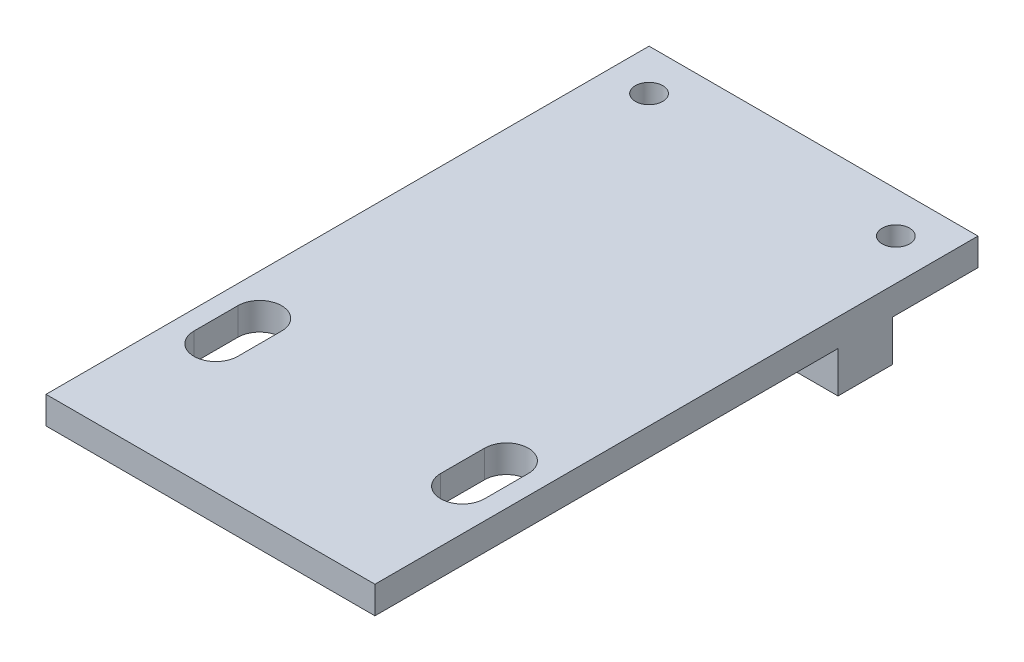
ISO-10303-21;
HEADER;
FILE_DESCRIPTION(('STEP AP214'),'2;1');
FILE_NAME('part.step','',(''),(''),'','','');
FILE_SCHEMA(('AUTOMOTIVE_DESIGN { 1 0 10303 214 1 1 1 1 }'));
ENDSEC;
DATA;
#1=APPLICATION_CONTEXT('core data for automotive mechanical design processes');
#2=APPLICATION_PROTOCOL_DEFINITION('international standard','automotive_design',2000,#1);
#3=PRODUCT_CONTEXT('',#1,'mechanical');
#4=PRODUCT('Part','Part','',(#3));
#5=PRODUCT_RELATED_PRODUCT_CATEGORY('part','',(#4));
#6=PRODUCT_DEFINITION_FORMATION('','',#4);
#7=PRODUCT_DEFINITION_CONTEXT('part definition',#1,'design');
#8=PRODUCT_DEFINITION('design','',#6,#7);
#9=PRODUCT_DEFINITION_SHAPE('','',#8);
#10=(LENGTH_UNIT() NAMED_UNIT(*) SI_UNIT(.MILLI.,.METRE.));
#11=(NAMED_UNIT(*) PLANE_ANGLE_UNIT() SI_UNIT($,.RADIAN.));
#12=(NAMED_UNIT(*) SI_UNIT($,.STERADIAN.) SOLID_ANGLE_UNIT());
#13=UNCERTAINTY_MEASURE_WITH_UNIT(LENGTH_MEASURE(1.E-05),#10,'distance_accuracy_value','');
#14=(GEOMETRIC_REPRESENTATION_CONTEXT(3) GLOBAL_UNCERTAINTY_ASSIGNED_CONTEXT((#13)) GLOBAL_UNIT_ASSIGNED_CONTEXT((#10,
#11,#12)) REPRESENTATION_CONTEXT('',''));
#15=CARTESIAN_POINT('',(0.,0.,0.));
#16=DIRECTION('',(0.,0.,1.));
#17=DIRECTION('',(1.,0.,0.));
#18=AXIS2_PLACEMENT_3D('',#15,#16,#17);
#19=CARTESIAN_POINT('',(0.,0.,0.));
#20=DIRECTION('',(0.,-1.,0.));
#21=DIRECTION('',(0.,0.,-1.));
#22=AXIS2_PLACEMENT_3D('',#19,#20,#21);
#23=PLANE('',#22);
#24=DIRECTION('',(0.,0.,1.));
#25=VECTOR('',#24,1.);
#26=CARTESIAN_POINT('',(1.39715437145116,0.,0.));
#27=LINE('',#26,#25);
#28=CARTESIAN_POINT('',(1.39715437145116,0.,-16.5950768512365));
#29=VERTEX_POINT('',#28);
#30=CARTESIAN_POINT('',(1.39715437145116,0.,-13.3950768512365));
#31=VERTEX_POINT('',#30);
#32=EDGE_CURVE('E258',#29,#31,#27,.T.);
#33=ORIENTED_EDGE('',*,*,#32,.T.);
#34=CARTESIAN_POINT('',(2.99715437145116,0.,-13.3950768512365));
#35=DIRECTION('',(0.,1.,0.));
#36=DIRECTION('',(0.,0.,1.));
#37=AXIS2_PLACEMENT_3D('',#34,#35,#36);
#38=CIRCLE('',#37,1.6);
#39=CARTESIAN_POINT('',(4.59715437145116,0.,-13.3950768512365));
#40=VERTEX_POINT('',#39);
#41=EDGE_CURVE('E261',#31,#40,#38,.T.);
#42=ORIENTED_EDGE('',*,*,#41,.T.);
#43=DIRECTION('',(0.,0.,1.));
#44=VECTOR('',#43,1.);
#45=CARTESIAN_POINT('',(4.59715437145116,0.,0.));
#46=LINE('',#45,#44);
#47=CARTESIAN_POINT('',(4.59715437145116,0.,-16.5950768512365));
#48=VERTEX_POINT('',#47);
#49=EDGE_CURVE('E265',#48,#40,#46,.T.);
#50=ORIENTED_EDGE('',*,*,#49,.F.);
#51=CARTESIAN_POINT('',(2.99715437145116,0.,-16.5950768512365));
#52=DIRECTION('',(0.,1.,0.));
#53=DIRECTION('',(0.,0.,1.));
#54=AXIS2_PLACEMENT_3D('',#51,#52,#53);
#55=CIRCLE('',#54,1.6);
#56=EDGE_CURVE('E268',#48,#29,#55,.T.);
#57=ORIENTED_EDGE('',*,*,#56,.T.);
#58=EDGE_LOOP('',(#33,#42,#50,#57));
#59=FACE_BOUND('',#58,.T.);
#60=DIRECTION('',(0.,0.,1.));
#61=VECTOR('',#60,1.);
#62=CARTESIAN_POINT('',(19.4000469244504,0.,0.));
#63=LINE('',#62,#61);
#64=CARTESIAN_POINT('',(19.4000469244504,0.,-16.5950768512365));
#65=VERTEX_POINT('',#64);
#66=CARTESIAN_POINT('',(19.4000469244504,0.,-13.3950768512365));
#67=VERTEX_POINT('',#66);
#68=EDGE_CURVE('E226',#65,#67,#63,.T.);
#69=ORIENTED_EDGE('',*,*,#68,.T.);
#70=CARTESIAN_POINT('',(21.0000469244504,0.,-13.3950768512365));
#71=DIRECTION('',(0.,1.,0.));
#72=DIRECTION('',(0.,0.,1.));
#73=AXIS2_PLACEMENT_3D('',#70,#71,#72);
#74=CIRCLE('',#73,1.6);
#75=CARTESIAN_POINT('',(22.6000469244504,0.,-13.3950768512365));
#76=VERTEX_POINT('',#75);
#77=EDGE_CURVE('E229',#67,#76,#74,.T.);
#78=ORIENTED_EDGE('',*,*,#77,.T.);
#79=DIRECTION('',(0.,0.,1.));
#80=VECTOR('',#79,1.);
#81=CARTESIAN_POINT('',(22.6000469244504,0.,0.));
#82=LINE('',#81,#80);
#83=CARTESIAN_POINT('',(22.6000469244504,0.,-16.5950768512365));
#84=VERTEX_POINT('',#83);
#85=EDGE_CURVE('E233',#84,#76,#82,.T.);
#86=ORIENTED_EDGE('',*,*,#85,.F.);
#87=CARTESIAN_POINT('',(21.0000469244504,0.,-16.5950768512365));
#88=DIRECTION('',(0.,1.,0.));
#89=DIRECTION('',(0.,0.,1.));
#90=AXIS2_PLACEMENT_3D('',#87,#88,#89);
#91=CIRCLE('',#90,1.6);
#92=EDGE_CURVE('E236',#84,#65,#91,.T.);
#93=ORIENTED_EDGE('',*,*,#92,.T.);
#94=EDGE_LOOP('',(#69,#78,#86,#93));
#95=FACE_BOUND('',#94,.T.);
#96=DIRECTION('',(0.,0.,-1.));
#97=VECTOR('',#96,1.);
#98=CARTESIAN_POINT('',(24.,0.,0.));
#99=LINE('',#98,#97);
#100=CARTESIAN_POINT('',(24.,0.,-4.));
#101=VERTEX_POINT('',#100);
#102=CARTESIAN_POINT('',(24.,0.,-37.7832741595441));
#103=VERTEX_POINT('',#102);
#104=EDGE_CURVE('E194',#101,#103,#99,.T.);
#105=ORIENTED_EDGE('',*,*,#104,.F.);
#106=DIRECTION('',(1.,0.,0.));
#107=VECTOR('',#106,1.);
#108=CARTESIAN_POINT('',(24.,0.,-4.));
#109=LINE('',#108,#107);
#110=CARTESIAN_POINT('',(0.,0.,-4.));
#111=VERTEX_POINT('',#110);
#112=EDGE_CURVE('E184',#111,#101,#109,.T.);
#113=ORIENTED_EDGE('',*,*,#112,.F.);
#114=DIRECTION('',(0.,0.,1.));
#115=VECTOR('',#114,1.);
#116=CARTESIAN_POINT('',(0.,0.,0.));
#117=LINE('',#116,#115);
#118=CARTESIAN_POINT('',(0.,0.,-37.7832741595441));
#119=VERTEX_POINT('',#118);
#120=EDGE_CURVE('E59',#119,#111,#117,.T.);
#121=ORIENTED_EDGE('',*,*,#120,.F.);
#122=DIRECTION('',(-1.,0.,0.));
#123=VECTOR('',#122,1.);
#124=CARTESIAN_POINT('',(9.99674954252594,0.,-37.7832741595441));
#125=LINE('',#124,#123);
#126=CARTESIAN_POINT('',(9.99674954252594,0.,-37.7832741595441));
#127=VERTEX_POINT('',#126);
#128=EDGE_CURVE('E380',#127,#119,#125,.T.);
#129=ORIENTED_EDGE('',*,*,#128,.F.);
#130=DIRECTION('',(0.,0.,-1.));
#131=VECTOR('',#130,1.);
#132=CARTESIAN_POINT('',(9.99674954252594,0.,-19.1071709937525));
#133=LINE('',#132,#131);
#134=CARTESIAN_POINT('',(9.99674954252594,0.,-19.1071709937525));
#135=VERTEX_POINT('',#134);
#136=EDGE_CURVE('E209',#135,#127,#133,.T.);
#137=ORIENTED_EDGE('',*,*,#136,.F.);
#138=DIRECTION('',(-1.,0.,0.));
#139=VECTOR('',#138,1.);
#140=CARTESIAN_POINT('',(9.99674954252594,0.,-19.1071709937525));
#141=LINE('',#140,#139);
#142=CARTESIAN_POINT('',(13.9993789873554,0.,-19.1071709937525));
#143=VERTEX_POINT('',#142);
#144=EDGE_CURVE('E213',#143,#135,#141,.T.);
#145=ORIENTED_EDGE('',*,*,#144,.F.);
#146=DIRECTION('',(0.,0.,1.));
#147=VECTOR('',#146,1.);
#148=CARTESIAN_POINT('',(13.9993789873554,0.,-19.1071709937525));
#149=LINE('',#148,#147);
#150=CARTESIAN_POINT('',(13.9993789873554,0.,-37.7832741595441));
#151=VERTEX_POINT('',#150);
#152=EDGE_CURVE('E37',#151,#143,#149,.T.);
#153=ORIENTED_EDGE('',*,*,#152,.F.);
#154=DIRECTION('',(-1.,0.,0.));
#155=VECTOR('',#154,1.);
#156=CARTESIAN_POINT('',(13.9993789873554,0.,-37.7832741595441));
#157=LINE('',#156,#155);
#158=EDGE_CURVE('E336',#103,#151,#157,.T.);
#159=ORIENTED_EDGE('',*,*,#158,.F.);
#160=EDGE_LOOP('',(#105,#113,#121,#129,#137,#145,#153,#159));
#161=FACE_BOUND('',#160,.T.);
#162=ADVANCED_FACE('F33',(#59,#95,#161),#23,.T.);
#163=CARTESIAN_POINT('',(0.,2.,0.));
#164=DIRECTION('',(1.,0.,0.));
#165=DIRECTION('',(0.,0.,-1.));
#166=AXIS2_PLACEMENT_3D('',#163,#164,#165);
#167=PLANE('',#166);
#168=DIRECTION('',(0.,-1.,0.));
#169=VECTOR('',#168,1.);
#170=CARTESIAN_POINT('',(0.,0.,-4.));
#171=LINE('',#170,#169);
#172=CARTESIAN_POINT('',(0.,2.,-4.));
#173=VERTEX_POINT('',#172);
#174=EDGE_CURVE('E174',#173,#111,#171,.T.);
#175=ORIENTED_EDGE('',*,*,#174,.F.);
#176=DIRECTION('',(0.,0.,1.));
#177=VECTOR('',#176,1.);
#178=CARTESIAN_POINT('',(0.,2.,0.));
#179=LINE('',#178,#177);
#180=CARTESIAN_POINT('',(0.,2.,-48.));
#181=VERTEX_POINT('',#180);
#182=EDGE_CURVE('E182',#181,#173,#179,.T.);
#183=ORIENTED_EDGE('',*,*,#182,.F.);
#184=DIRECTION('',(0.,-1.,0.));
#185=VECTOR('',#184,1.);
#186=CARTESIAN_POINT('',(0.,2.,-48.));
#187=LINE('',#186,#185);
#188=CARTESIAN_POINT('',(0.,0.,-48.));
#189=VERTEX_POINT('',#188);
#190=EDGE_CURVE('E43',#181,#189,#187,.T.);
#191=ORIENTED_EDGE('',*,*,#190,.T.);
#192=CARTESIAN_POINT('',(0.,0.,-41.7785444372392));
#193=VERTEX_POINT('',#192);
#194=EDGE_CURVE('E201',#189,#193,#117,.T.);
#195=ORIENTED_EDGE('',*,*,#194,.T.);
#196=DIRECTION('',(0.,1.,0.));
#197=VECTOR('',#196,1.);
#198=CARTESIAN_POINT('',(0.,-3.,-41.7785444372392));
#199=LINE('',#198,#197);
#200=CARTESIAN_POINT('',(0.,-3.,-41.7785444372392));
#201=VERTEX_POINT('',#200);
#202=EDGE_CURVE('E382',#201,#193,#199,.T.);
#203=ORIENTED_EDGE('',*,*,#202,.F.);
#204=DIRECTION('',(0.,0.,-1.));
#205=VECTOR('',#204,1.);
#206=CARTESIAN_POINT('',(0.,-3.,-41.7785444372392));
#207=LINE('',#206,#205);
#208=CARTESIAN_POINT('',(0.,-3.,-37.7832741595441));
#209=VERTEX_POINT('',#208);
#210=EDGE_CURVE('E379',#209,#201,#207,.T.);
#211=ORIENTED_EDGE('',*,*,#210,.F.);
#212=DIRECTION('',(0.,1.,0.));
#213=VECTOR('',#212,1.);
#214=CARTESIAN_POINT('',(0.,-3.,-37.7832741595441));
#215=LINE('',#214,#213);
#216=EDGE_CURVE('E377',#209,#119,#215,.T.);
#217=ORIENTED_EDGE('',*,*,#216,.T.);
#218=ORIENTED_EDGE('',*,*,#120,.T.);
#219=EDGE_LOOP('',(#175,#183,#191,#195,#203,#211,#217,#218));
#220=FACE_BOUND('',#219,.T.);
#221=ADVANCED_FACE('F35',(#220),#167,.F.);
#222=CARTESIAN_POINT('',(24.,2.,0.));
#223=DIRECTION('',(-1.,0.,0.));
#224=DIRECTION('',(0.,0.,1.));
#225=AXIS2_PLACEMENT_3D('',#222,#223,#224);
#226=PLANE('',#225);
#227=DIRECTION('',(0.,1.,0.));
#228=VECTOR('',#227,1.);
#229=CARTESIAN_POINT('',(24.,0.,-4.));
#230=LINE('',#229,#228);
#231=CARTESIAN_POINT('',(24.,2.,-4.));
#232=VERTEX_POINT('',#231);
#233=EDGE_CURVE('E51',#101,#232,#230,.T.);
#234=ORIENTED_EDGE('',*,*,#233,.F.);
#235=ORIENTED_EDGE('',*,*,#104,.T.);
#236=DIRECTION('',(0.,1.,0.));
#237=VECTOR('',#236,1.);
#238=CARTESIAN_POINT('',(24.,-3.,-37.7832741595441));
#239=LINE('',#238,#237);
#240=CARTESIAN_POINT('',(24.,-3.,-37.7832741595441));
#241=VERTEX_POINT('',#240);
#242=EDGE_CURVE('E341',#241,#103,#239,.T.);
#243=ORIENTED_EDGE('',*,*,#242,.F.);
#244=DIRECTION('',(0.,0.,1.));
#245=VECTOR('',#244,1.);
#246=CARTESIAN_POINT('',(24.,-3.,-41.7785444372392));
#247=LINE('',#246,#245);
#248=CARTESIAN_POINT('',(24.,-3.,-41.7785444372392));
#249=VERTEX_POINT('',#248);
#250=EDGE_CURVE('E391',#249,#241,#247,.T.);
#251=ORIENTED_EDGE('',*,*,#250,.F.);
#252=DIRECTION('',(0.,1.,0.));
#253=VECTOR('',#252,1.);
#254=CARTESIAN_POINT('',(24.,-3.,-41.7785444372392));
#255=LINE('',#254,#253);
#256=CARTESIAN_POINT('',(24.,0.,-41.7785444372392));
#257=VERTEX_POINT('',#256);
#258=EDGE_CURVE('E348',#249,#257,#255,.T.);
#259=ORIENTED_EDGE('',*,*,#258,.T.);
#260=CARTESIAN_POINT('',(24.,0.,-48.));
#261=VERTEX_POINT('',#260);
#262=EDGE_CURVE('E204',#257,#261,#99,.T.);
#263=ORIENTED_EDGE('',*,*,#262,.T.);
#264=DIRECTION('',(0.,-1.,0.));
#265=VECTOR('',#264,1.);
#266=CARTESIAN_POINT('',(24.,2.,-48.));
#267=LINE('',#266,#265);
#268=CARTESIAN_POINT('',(24.,2.,-48.));
#269=VERTEX_POINT('',#268);
#270=EDGE_CURVE('E11',#269,#261,#267,.T.);
#271=ORIENTED_EDGE('',*,*,#270,.F.);
#272=DIRECTION('',(0.,0.,-1.));
#273=VECTOR('',#272,1.);
#274=CARTESIAN_POINT('',(24.,2.,0.));
#275=LINE('',#274,#273);
#276=EDGE_CURVE('E190',#232,#269,#275,.T.);
#277=ORIENTED_EDGE('',*,*,#276,.F.);
#278=EDGE_LOOP('',(#234,#235,#243,#251,#259,#263,#271,#277));
#279=FACE_BOUND('',#278,.T.);
#280=ADVANCED_FACE('F306',(#279),#226,.F.);
#281=CARTESIAN_POINT('',(0.,2.,0.));
#282=DIRECTION('',(0.,-1.,0.));
#283=DIRECTION('',(0.,0.,-1.));
#284=AXIS2_PLACEMENT_3D('',#281,#282,#283);
#285=PLANE('',#284);
#286=CARTESIAN_POINT('',(2.99574275563261,2.,-45.0048101927837));
#287=DIRECTION('',(0.,1.,0.));
#288=DIRECTION('',(0.,0.,1.));
#289=AXIS2_PLACEMENT_3D('',#286,#287,#288);
#290=CIRCLE('',#289,1.);
#291=CARTESIAN_POINT('',(2.99574275563261,2.,-44.0048101927837));
#292=VERTEX_POINT('',#291);
#293=EDGE_CURVE('E197',#292,#292,#290,.T.);
#294=ORIENTED_EDGE('',*,*,#293,.F.);
#295=EDGE_LOOP('',(#294));
#296=FACE_BOUND('',#295,.T.);
#297=CARTESIAN_POINT('',(21.0005283156328,2.,-45.0048101927837));
#298=DIRECTION('',(0.,1.,0.));
#299=DIRECTION('',(0.,0.,1.));
#300=AXIS2_PLACEMENT_3D('',#297,#298,#299);
#301=CIRCLE('',#300,1.);
#302=CARTESIAN_POINT('',(21.0005283156328,2.,-44.0048101927837));
#303=VERTEX_POINT('',#302);
#304=EDGE_CURVE('E283',#303,#303,#301,.T.);
#305=ORIENTED_EDGE('',*,*,#304,.F.);
#306=EDGE_LOOP('',(#305));
#307=FACE_BOUND('',#306,.T.);
#308=CARTESIAN_POINT('',(2.99715437145116,2.,-13.3950768512365));
#309=DIRECTION('',(0.,1.,0.));
#310=DIRECTION('',(0.,0.,1.));
#311=AXIS2_PLACEMENT_3D('',#308,#309,#310);
#312=CIRCLE('',#311,1.6);
#313=CARTESIAN_POINT('',(1.39715437145116,2.,-13.3950768512365));
#314=VERTEX_POINT('',#313);
#315=CARTESIAN_POINT('',(4.59715437145116,2.,-13.3950768512365));
#316=VERTEX_POINT('',#315);
#317=EDGE_CURVE('E273',#314,#316,#312,.T.);
#318=ORIENTED_EDGE('',*,*,#317,.F.);
#319=DIRECTION('',(0.,0.,1.));
#320=VECTOR('',#319,1.);
#321=CARTESIAN_POINT('',(1.39715437145116,2.,0.));
#322=LINE('',#321,#320);
#323=CARTESIAN_POINT('',(1.39715437145116,2.,-16.5950768512365));
#324=VERTEX_POINT('',#323);
#325=EDGE_CURVE('E251',#324,#314,#322,.T.);
#326=ORIENTED_EDGE('',*,*,#325,.F.);
#327=CARTESIAN_POINT('',(2.99715437145116,2.,-16.5950768512365));
#328=DIRECTION('',(0.,1.,0.));
#329=DIRECTION('',(0.,0.,1.));
#330=AXIS2_PLACEMENT_3D('',#327,#328,#329);
#331=CIRCLE('',#330,1.6);
#332=CARTESIAN_POINT('',(4.59715437145116,2.,-16.5950768512365));
#333=VERTEX_POINT('',#332);
#334=EDGE_CURVE('E262',#333,#324,#331,.T.);
#335=ORIENTED_EDGE('',*,*,#334,.F.);
#336=DIRECTION('',(0.,0.,1.));
#337=VECTOR('',#336,1.);
#338=CARTESIAN_POINT('',(4.59715437145116,2.,0.));
#339=LINE('',#338,#337);
#340=EDGE_CURVE('E276',#333,#316,#339,.T.);
#341=ORIENTED_EDGE('',*,*,#340,.T.);
#342=EDGE_LOOP('',(#318,#326,#335,#341));
#343=FACE_BOUND('',#342,.T.);
#344=CARTESIAN_POINT('',(21.0000469244504,2.,-13.3950768512365));
#345=DIRECTION('',(0.,1.,0.));
#346=DIRECTION('',(0.,0.,1.));
#347=AXIS2_PLACEMENT_3D('',#344,#345,#346);
#348=CIRCLE('',#347,1.6);
#349=CARTESIAN_POINT('',(19.4000469244504,2.,-13.3950768512365));
#350=VERTEX_POINT('',#349);
#351=CARTESIAN_POINT('',(22.6000469244504,2.,-13.3950768512365));
#352=VERTEX_POINT('',#351);
#353=EDGE_CURVE('E241',#350,#352,#348,.T.);
#354=ORIENTED_EDGE('',*,*,#353,.F.);
#355=DIRECTION('',(0.,0.,1.));
#356=VECTOR('',#355,1.);
#357=CARTESIAN_POINT('',(19.4000469244504,2.,0.));
#358=LINE('',#357,#356);
#359=CARTESIAN_POINT('',(19.4000469244504,2.,-16.5950768512365));
#360=VERTEX_POINT('',#359);
#361=EDGE_CURVE('E225',#360,#350,#358,.T.);
#362=ORIENTED_EDGE('',*,*,#361,.F.);
#363=CARTESIAN_POINT('',(21.0000469244504,2.,-16.5950768512365));
#364=DIRECTION('',(0.,1.,0.));
#365=DIRECTION('',(0.,0.,1.));
#366=AXIS2_PLACEMENT_3D('',#363,#364,#365);
#367=CIRCLE('',#366,1.6);
#368=CARTESIAN_POINT('',(22.6000469244504,2.,-16.5950768512365));
#369=VERTEX_POINT('',#368);
#370=EDGE_CURVE('E230',#369,#360,#367,.T.);
#371=ORIENTED_EDGE('',*,*,#370,.F.);
#372=DIRECTION('',(0.,0.,1.));
#373=VECTOR('',#372,1.);
#374=CARTESIAN_POINT('',(22.6000469244504,2.,0.));
#375=LINE('',#374,#373);
#376=EDGE_CURVE('E244',#369,#352,#375,.T.);
#377=ORIENTED_EDGE('',*,*,#376,.T.);
#378=EDGE_LOOP('',(#354,#362,#371,#377));
#379=FACE_BOUND('',#378,.T.);
#380=DIRECTION('',(-1.,0.,0.));
#381=VECTOR('',#380,1.);
#382=CARTESIAN_POINT('',(24.,2.,-4.));
#383=LINE('',#382,#381);
#384=EDGE_CURVE('E171',#232,#173,#383,.T.);
#385=ORIENTED_EDGE('',*,*,#384,.F.);
#386=ORIENTED_EDGE('',*,*,#276,.T.);
#387=DIRECTION('',(-1.,0.,0.));
#388=VECTOR('',#387,1.);
#389=CARTESIAN_POINT('',(0.,2.,-48.));
#390=LINE('',#389,#388);
#391=EDGE_CURVE('E188',#269,#181,#390,.T.);
#392=ORIENTED_EDGE('',*,*,#391,.T.);
#393=ORIENTED_EDGE('',*,*,#182,.T.);
#394=EDGE_LOOP('',(#385,#386,#392,#393));
#395=FACE_BOUND('',#394,.T.);
#396=ADVANCED_FACE('F186',(#296,#307,#343,#379,#395),#285,.F.);
#397=CARTESIAN_POINT('',(21.0005283156328,0.,-45.0048101927837));
#398=DIRECTION('',(0.,1.,0.));
#399=DIRECTION('',(0.,0.,1.));
#400=AXIS2_PLACEMENT_3D('',#397,#398,#399);
#401=CIRCLE('',#400,1.);
#402=CARTESIAN_POINT('',(21.0005283156328,0.,-44.0048101927837));
#403=VERTEX_POINT('',#402);
#404=EDGE_CURVE('E290',#403,#403,#401,.T.);
#405=ORIENTED_EDGE('',*,*,#404,.T.);
#406=EDGE_LOOP('',(#405));
#407=FACE_BOUND('',#406,.T.);
#408=CARTESIAN_POINT('',(2.99574275563261,0.,-45.0048101927837));
#409=DIRECTION('',(0.,1.,0.));
#410=DIRECTION('',(0.,0.,1.));
#411=AXIS2_PLACEMENT_3D('',#408,#409,#410);
#412=CIRCLE('',#411,1.);
#413=CARTESIAN_POINT('',(2.99574275563261,0.,-44.0048101927837));
#414=VERTEX_POINT('',#413);
#415=EDGE_CURVE('E294',#414,#414,#412,.T.);
#416=ORIENTED_EDGE('',*,*,#415,.T.);
#417=EDGE_LOOP('',(#416));
#418=FACE_BOUND('',#417,.T.);
#419=DIRECTION('',(1.,0.,0.));
#420=VECTOR('',#419,1.);
#421=CARTESIAN_POINT('',(13.9993789873554,0.,-41.7785444372392));
#422=LINE('',#421,#420);
#423=EDGE_CURVE('E358',#193,#257,#422,.T.);
#424=ORIENTED_EDGE('',*,*,#423,.F.);
#425=ORIENTED_EDGE('',*,*,#194,.F.);
#426=DIRECTION('',(-1.,0.,0.));
#427=VECTOR('',#426,1.);
#428=CARTESIAN_POINT('',(0.,0.,-48.));
#429=LINE('',#428,#427);
#430=EDGE_CURVE('E191',#261,#189,#429,.T.);
#431=ORIENTED_EDGE('',*,*,#430,.F.);
#432=ORIENTED_EDGE('',*,*,#262,.F.);
#433=EDGE_LOOP('',(#424,#425,#431,#432));
#434=FACE_BOUND('',#433,.T.);
#435=ADVANCED_FACE('F305',(#407,#418,#434),#23,.T.);
#436=CARTESIAN_POINT('',(9.99674954252594,-3.,-19.1071709937525));
#437=DIRECTION('',(1.,0.,0.));
#438=DIRECTION('',(0.,0.,-1.));
#439=AXIS2_PLACEMENT_3D('',#436,#437,#438);
#440=PLANE('',#439);
#441=DIRECTION('',(0.,1.,0.));
#442=VECTOR('',#441,1.);
#443=CARTESIAN_POINT('',(9.99674954252594,-3.,-37.7832741595441));
#444=LINE('',#443,#442);
#445=CARTESIAN_POINT('',(9.99674954252594,-3.,-37.7832741595441));
#446=VERTEX_POINT('',#445);
#447=EDGE_CURVE('E376',#446,#127,#444,.T.);
#448=ORIENTED_EDGE('',*,*,#447,.F.);
#449=DIRECTION('',(0.,0.,-1.));
#450=VECTOR('',#449,1.);
#451=CARTESIAN_POINT('',(9.99674954252594,-3.,-19.1071709937525));
#452=LINE('',#451,#450);
#453=CARTESIAN_POINT('',(9.99674954252594,-3.,-19.1071709937525));
#454=VERTEX_POINT('',#453);
#455=EDGE_CURVE('E222',#454,#446,#452,.T.);
#456=ORIENTED_EDGE('',*,*,#455,.F.);
#457=DIRECTION('',(0.,1.,0.));
#458=VECTOR('',#457,1.);
#459=CARTESIAN_POINT('',(9.99674954252594,-3.,-19.1071709937525));
#460=LINE('',#459,#458);
#461=EDGE_CURVE('E218',#454,#135,#460,.T.);
#462=ORIENTED_EDGE('',*,*,#461,.T.);
#463=ORIENTED_EDGE('',*,*,#136,.T.);
#464=EDGE_LOOP('',(#448,#456,#462,#463));
#465=FACE_BOUND('',#464,.T.);
#466=ADVANCED_FACE('F401',(#465),#440,.F.);
#467=CARTESIAN_POINT('',(13.9993789873554,-3.,-19.1071709937525));
#468=DIRECTION('',(-1.,0.,0.));
#469=DIRECTION('',(0.,0.,1.));
#470=AXIS2_PLACEMENT_3D('',#467,#468,#469);
#471=PLANE('',#470);
#472=DIRECTION('',(0.,1.,0.));
#473=VECTOR('',#472,1.);
#474=CARTESIAN_POINT('',(13.9993789873554,-3.,-37.7832741595441));
#475=LINE('',#474,#473);
#476=CARTESIAN_POINT('',(13.9993789873554,-3.,-37.7832741595441));
#477=VERTEX_POINT('',#476);
#478=EDGE_CURVE('E349',#477,#151,#475,.T.);
#479=ORIENTED_EDGE('',*,*,#478,.T.);
#480=ORIENTED_EDGE('',*,*,#152,.T.);
#481=DIRECTION('',(0.,1.,0.));
#482=VECTOR('',#481,1.);
#483=CARTESIAN_POINT('',(13.9993789873554,-3.,-19.1071709937525));
#484=LINE('',#483,#482);
#485=CARTESIAN_POINT('',(13.9993789873554,-3.,-19.1071709937525));
#486=VERTEX_POINT('',#485);
#487=EDGE_CURVE('E221',#486,#143,#484,.T.);
#488=ORIENTED_EDGE('',*,*,#487,.F.);
#489=DIRECTION('',(0.,0.,1.));
#490=VECTOR('',#489,1.);
#491=CARTESIAN_POINT('',(13.9993789873554,-3.,-19.1071709937525));
#492=LINE('',#491,#490);
#493=EDGE_CURVE('E212',#477,#486,#492,.T.);
#494=ORIENTED_EDGE('',*,*,#493,.F.);
#495=EDGE_LOOP('',(#479,#480,#488,#494));
#496=FACE_BOUND('',#495,.T.);
#497=ADVANCED_FACE('F396',(#496),#471,.F.);
#498=CARTESIAN_POINT('',(0.,2.,-48.));
#499=DIRECTION('',(0.,0.,1.));
#500=DIRECTION('',(1.,0.,0.));
#501=AXIS2_PLACEMENT_3D('',#498,#499,#500);
#502=PLANE('',#501);
#503=ORIENTED_EDGE('',*,*,#430,.T.);
#504=ORIENTED_EDGE('',*,*,#190,.F.);
#505=ORIENTED_EDGE('',*,*,#391,.F.);
#506=ORIENTED_EDGE('',*,*,#270,.T.);
#507=EDGE_LOOP('',(#503,#504,#505,#506));
#508=FACE_BOUND('',#507,.T.);
#509=ADVANCED_FACE('F412',(#508),#502,.F.);
#510=CARTESIAN_POINT('',(2.99574275563261,0.,-45.0048101927837));
#511=DIRECTION('',(0.,1.,0.));
#512=DIRECTION('',(0.,0.,1.));
#513=AXIS2_PLACEMENT_3D('',#510,#511,#512);
#514=CYLINDRICAL_SURFACE('',#513,1.);
#515=ORIENTED_EDGE('',*,*,#415,.F.);
#516=EDGE_LOOP('',(#515));
#517=FACE_BOUND('',#516,.T.);
#518=ORIENTED_EDGE('',*,*,#293,.T.);
#519=EDGE_LOOP('',(#518));
#520=FACE_BOUND('',#519,.T.);
#521=ADVANCED_FACE('F301',(#517,#520),#514,.F.);
#522=CARTESIAN_POINT('',(21.0005283156328,0.,-45.0048101927837));
#523=DIRECTION('',(0.,1.,0.));
#524=DIRECTION('',(0.,0.,1.));
#525=AXIS2_PLACEMENT_3D('',#522,#523,#524);
#526=CYLINDRICAL_SURFACE('',#525,1.);
#527=ORIENTED_EDGE('',*,*,#404,.F.);
#528=EDGE_LOOP('',(#527));
#529=FACE_BOUND('',#528,.T.);
#530=ORIENTED_EDGE('',*,*,#304,.T.);
#531=EDGE_LOOP('',(#530));
#532=FACE_BOUND('',#531,.T.);
#533=ADVANCED_FACE('F419',(#529,#532),#526,.F.);
#534=CARTESIAN_POINT('',(1.39715437145116,0.,0.));
#535=DIRECTION('',(-1.,0.,0.));
#536=DIRECTION('',(0.,0.,1.));
#537=AXIS2_PLACEMENT_3D('',#534,#535,#536);
#538=PLANE('',#537);
#539=ORIENTED_EDGE('',*,*,#325,.T.);
#540=DIRECTION('',(0.,1.,0.));
#541=VECTOR('',#540,1.);
#542=CARTESIAN_POINT('',(1.39715437145116,0.,-13.3950768512365));
#543=LINE('',#542,#541);
#544=EDGE_CURVE('E271',#31,#314,#543,.T.);
#545=ORIENTED_EDGE('',*,*,#544,.F.);
#546=ORIENTED_EDGE('',*,*,#32,.F.);
#547=DIRECTION('',(0.,1.,0.));
#548=VECTOR('',#547,1.);
#549=CARTESIAN_POINT('',(1.39715437145116,0.,-16.5950768512365));
#550=LINE('',#549,#548);
#551=EDGE_CURVE('E281',#29,#324,#550,.T.);
#552=ORIENTED_EDGE('',*,*,#551,.T.);
#553=EDGE_LOOP('',(#539,#545,#546,#552));
#554=FACE_BOUND('',#553,.T.);
#555=ADVANCED_FACE('F571',(#554),#538,.F.);
#556=CARTESIAN_POINT('',(2.99715437145116,0.,-16.5950768512365));
#557=DIRECTION('',(0.,1.,0.));
#558=DIRECTION('',(0.,0.,1.));
#559=AXIS2_PLACEMENT_3D('',#556,#557,#558);
#560=CYLINDRICAL_SURFACE('',#559,1.6);
#561=ORIENTED_EDGE('',*,*,#334,.T.);
#562=ORIENTED_EDGE('',*,*,#551,.F.);
#563=ORIENTED_EDGE('',*,*,#56,.F.);
#564=DIRECTION('',(0.,1.,0.));
#565=VECTOR('',#564,1.);
#566=CARTESIAN_POINT('',(4.59715437145116,0.,-16.5950768512365));
#567=LINE('',#566,#565);
#568=EDGE_CURVE('E284',#48,#333,#567,.T.);
#569=ORIENTED_EDGE('',*,*,#568,.T.);
#570=EDGE_LOOP('',(#561,#562,#563,#569));
#571=FACE_BOUND('',#570,.T.);
#572=ADVANCED_FACE('F561',(#571),#560,.F.);
#573=CARTESIAN_POINT('',(4.59715437145116,0.,0.));
#574=DIRECTION('',(-1.,0.,0.));
#575=DIRECTION('',(0.,0.,1.));
#576=AXIS2_PLACEMENT_3D('',#573,#574,#575);
#577=PLANE('',#576);
#578=ORIENTED_EDGE('',*,*,#340,.F.);
#579=ORIENTED_EDGE('',*,*,#568,.F.);
#580=ORIENTED_EDGE('',*,*,#49,.T.);
#581=DIRECTION('',(0.,1.,0.));
#582=VECTOR('',#581,1.);
#583=CARTESIAN_POINT('',(4.59715437145116,0.,-13.3950768512365));
#584=LINE('',#583,#582);
#585=EDGE_CURVE('E286',#40,#316,#584,.T.);
#586=ORIENTED_EDGE('',*,*,#585,.T.);
#587=EDGE_LOOP('',(#578,#579,#580,#586));
#588=FACE_BOUND('',#587,.T.);
#589=ADVANCED_FACE('F551',(#588),#577,.T.);
#590=CARTESIAN_POINT('',(2.99715437145116,0.,-13.3950768512365));
#591=DIRECTION('',(0.,1.,0.));
#592=DIRECTION('',(0.,0.,1.));
#593=AXIS2_PLACEMENT_3D('',#590,#591,#592);
#594=CYLINDRICAL_SURFACE('',#593,1.6);
#595=ORIENTED_EDGE('',*,*,#317,.T.);
#596=ORIENTED_EDGE('',*,*,#585,.F.);
#597=ORIENTED_EDGE('',*,*,#41,.F.);
#598=ORIENTED_EDGE('',*,*,#544,.T.);
#599=EDGE_LOOP('',(#595,#596,#597,#598));
#600=FACE_BOUND('',#599,.T.);
#601=ADVANCED_FACE('F542',(#600),#594,.F.);
#602=CARTESIAN_POINT('',(19.4000469244504,0.,0.));
#603=DIRECTION('',(-1.,0.,0.));
#604=DIRECTION('',(0.,0.,1.));
#605=AXIS2_PLACEMENT_3D('',#602,#603,#604);
#606=PLANE('',#605);
#607=ORIENTED_EDGE('',*,*,#361,.T.);
#608=DIRECTION('',(0.,1.,0.));
#609=VECTOR('',#608,1.);
#610=CARTESIAN_POINT('',(19.4000469244504,0.,-13.3950768512365));
#611=LINE('',#610,#609);
#612=EDGE_CURVE('E239',#67,#350,#611,.T.);
#613=ORIENTED_EDGE('',*,*,#612,.F.);
#614=ORIENTED_EDGE('',*,*,#68,.F.);
#615=DIRECTION('',(0.,1.,0.));
#616=VECTOR('',#615,1.);
#617=CARTESIAN_POINT('',(19.4000469244504,0.,-16.5950768512365));
#618=LINE('',#617,#616);
#619=EDGE_CURVE('E249',#65,#360,#618,.T.);
#620=ORIENTED_EDGE('',*,*,#619,.T.);
#621=EDGE_LOOP('',(#607,#613,#614,#620));
#622=FACE_BOUND('',#621,.T.);
#623=ADVANCED_FACE('F322',(#622),#606,.F.);
#624=CARTESIAN_POINT('',(21.0000469244504,0.,-16.5950768512365));
#625=DIRECTION('',(0.,1.,0.));
#626=DIRECTION('',(0.,0.,1.));
#627=AXIS2_PLACEMENT_3D('',#624,#625,#626);
#628=CYLINDRICAL_SURFACE('',#627,1.6);
#629=ORIENTED_EDGE('',*,*,#370,.T.);
#630=ORIENTED_EDGE('',*,*,#619,.F.);
#631=ORIENTED_EDGE('',*,*,#92,.F.);
#632=DIRECTION('',(0.,1.,0.));
#633=VECTOR('',#632,1.);
#634=CARTESIAN_POINT('',(22.6000469244504,0.,-16.5950768512365));
#635=LINE('',#634,#633);
#636=EDGE_CURVE('E252',#84,#369,#635,.T.);
#637=ORIENTED_EDGE('',*,*,#636,.T.);
#638=EDGE_LOOP('',(#629,#630,#631,#637));
#639=FACE_BOUND('',#638,.T.);
#640=ADVANCED_FACE('F325',(#639),#628,.F.);
#641=CARTESIAN_POINT('',(22.6000469244504,0.,0.));
#642=DIRECTION('',(-1.,0.,0.));
#643=DIRECTION('',(0.,0.,1.));
#644=AXIS2_PLACEMENT_3D('',#641,#642,#643);
#645=PLANE('',#644);
#646=ORIENTED_EDGE('',*,*,#376,.F.);
#647=ORIENTED_EDGE('',*,*,#636,.F.);
#648=ORIENTED_EDGE('',*,*,#85,.T.);
#649=DIRECTION('',(0.,1.,0.));
#650=VECTOR('',#649,1.);
#651=CARTESIAN_POINT('',(22.6000469244504,0.,-13.3950768512365));
#652=LINE('',#651,#650);
#653=EDGE_CURVE('E254',#76,#352,#652,.T.);
#654=ORIENTED_EDGE('',*,*,#653,.T.);
#655=EDGE_LOOP('',(#646,#647,#648,#654));
#656=FACE_BOUND('',#655,.T.);
#657=ADVANCED_FACE('F328',(#656),#645,.T.);
#658=CARTESIAN_POINT('',(21.0000469244504,0.,-13.3950768512365));
#659=DIRECTION('',(0.,1.,0.));
#660=DIRECTION('',(0.,0.,1.));
#661=AXIS2_PLACEMENT_3D('',#658,#659,#660);
#662=CYLINDRICAL_SURFACE('',#661,1.6);
#663=ORIENTED_EDGE('',*,*,#353,.T.);
#664=ORIENTED_EDGE('',*,*,#653,.F.);
#665=ORIENTED_EDGE('',*,*,#77,.F.);
#666=ORIENTED_EDGE('',*,*,#612,.T.);
#667=EDGE_LOOP('',(#663,#664,#665,#666));
#668=FACE_BOUND('',#667,.T.);
#669=ADVANCED_FACE('F318',(#668),#662,.F.);
#670=CARTESIAN_POINT('',(9.99674954252594,-3.,-19.1071709937525));
#671=DIRECTION('',(0.,0.,-1.));
#672=DIRECTION('',(-1.,0.,0.));
#673=AXIS2_PLACEMENT_3D('',#670,#671,#672);
#674=PLANE('',#673);
#675=ORIENTED_EDGE('',*,*,#144,.T.);
#676=ORIENTED_EDGE('',*,*,#461,.F.);
#677=DIRECTION('',(-1.,0.,0.));
#678=VECTOR('',#677,1.);
#679=CARTESIAN_POINT('',(9.99674954252594,-3.,-19.1071709937525));
#680=LINE('',#679,#678);
#681=EDGE_CURVE('E361',#486,#454,#680,.T.);
#682=ORIENTED_EDGE('',*,*,#681,.F.);
#683=ORIENTED_EDGE('',*,*,#487,.T.);
#684=EDGE_LOOP('',(#675,#676,#682,#683));
#685=FACE_BOUND('',#684,.T.);
#686=ADVANCED_FACE('F400',(#685),#674,.F.);
#687=CARTESIAN_POINT('',(0.,-3.,0.));
#688=DIRECTION('',(0.,-1.,0.));
#689=DIRECTION('',(0.,0.,-1.));
#690=AXIS2_PLACEMENT_3D('',#687,#688,#689);
#691=PLANE('',#690);
#692=DIRECTION('',(-1.,0.,0.));
#693=VECTOR('',#692,1.);
#694=CARTESIAN_POINT('',(13.9993789873554,-3.,-41.7785444372392));
#695=LINE('',#694,#693);
#696=EDGE_CURVE('E352',#249,#201,#695,.T.);
#697=ORIENTED_EDGE('',*,*,#696,.F.);
#698=ORIENTED_EDGE('',*,*,#250,.T.);
#699=DIRECTION('',(-1.,0.,0.));
#700=VECTOR('',#699,1.);
#701=CARTESIAN_POINT('',(13.9993789873554,-3.,-37.7832741595441));
#702=LINE('',#701,#700);
#703=EDGE_CURVE('E347',#241,#477,#702,.T.);
#704=ORIENTED_EDGE('',*,*,#703,.T.);
#705=ORIENTED_EDGE('',*,*,#493,.T.);
#706=ORIENTED_EDGE('',*,*,#681,.T.);
#707=ORIENTED_EDGE('',*,*,#455,.T.);
#708=DIRECTION('',(-1.,0.,0.));
#709=VECTOR('',#708,1.);
#710=CARTESIAN_POINT('',(9.99674954252594,-3.,-37.7832741595441));
#711=LINE('',#710,#709);
#712=EDGE_CURVE('E368',#446,#209,#711,.T.);
#713=ORIENTED_EDGE('',*,*,#712,.T.);
#714=ORIENTED_EDGE('',*,*,#210,.T.);
#715=EDGE_LOOP('',(#697,#698,#704,#705,#706,#707,#713,#714));
#716=FACE_BOUND('',#715,.T.);
#717=ADVANCED_FACE('F366',(#716),#691,.T.);
#718=CARTESIAN_POINT('',(13.9993789873554,7.39780722863359,-41.7785444372392));
#719=DIRECTION('',(0.,0.,1.));
#720=DIRECTION('',(1.,0.,0.));
#721=AXIS2_PLACEMENT_3D('',#718,#719,#720);
#722=PLANE('',#721);
#723=ORIENTED_EDGE('',*,*,#423,.T.);
#724=ORIENTED_EDGE('',*,*,#258,.F.);
#725=ORIENTED_EDGE('',*,*,#696,.T.);
#726=ORIENTED_EDGE('',*,*,#202,.T.);
#727=EDGE_LOOP('',(#723,#724,#725,#726));
#728=FACE_BOUND('',#727,.T.);
#729=ADVANCED_FACE('F405',(#728),#722,.F.);
#730=CARTESIAN_POINT('',(13.9993789873554,-3.,-37.7832741595441));
#731=DIRECTION('',(0.,0.,-1.));
#732=DIRECTION('',(-1.,0.,0.));
#733=AXIS2_PLACEMENT_3D('',#730,#731,#732);
#734=PLANE('',#733);
#735=ORIENTED_EDGE('',*,*,#158,.T.);
#736=ORIENTED_EDGE('',*,*,#478,.F.);
#737=ORIENTED_EDGE('',*,*,#703,.F.);
#738=ORIENTED_EDGE('',*,*,#242,.T.);
#739=EDGE_LOOP('',(#735,#736,#737,#738));
#740=FACE_BOUND('',#739,.T.);
#741=ADVANCED_FACE('F344',(#740),#734,.F.);
#742=CARTESIAN_POINT('',(9.99674954252594,-3.,-37.7832741595441));
#743=DIRECTION('',(0.,0.,-1.));
#744=DIRECTION('',(-1.,0.,0.));
#745=AXIS2_PLACEMENT_3D('',#742,#743,#744);
#746=PLANE('',#745);
#747=ORIENTED_EDGE('',*,*,#128,.T.);
#748=ORIENTED_EDGE('',*,*,#216,.F.);
#749=ORIENTED_EDGE('',*,*,#712,.F.);
#750=ORIENTED_EDGE('',*,*,#447,.T.);
#751=EDGE_LOOP('',(#747,#748,#749,#750));
#752=FACE_BOUND('',#751,.T.);
#753=ADVANCED_FACE('F375',(#752),#746,.F.);
#754=CARTESIAN_POINT('',(0.,0.,-4.));
#755=DIRECTION('',(0.,0.,1.));
#756=DIRECTION('',(1.,0.,0.));
#757=AXIS2_PLACEMENT_3D('',#754,#755,#756);
#758=PLANE('',#757);
#759=ORIENTED_EDGE('',*,*,#233,.T.);
#760=ORIENTED_EDGE('',*,*,#384,.T.);
#761=ORIENTED_EDGE('',*,*,#174,.T.);
#762=ORIENTED_EDGE('',*,*,#112,.T.);
#763=EDGE_LOOP('',(#759,#760,#761,#762));
#764=FACE_BOUND('',#763,.T.);
#765=ADVANCED_FACE('F173',(#764),#758,.T.);
#766=CLOSED_SHELL('',(#162,#221,#280,#396,#435,#466,#497,#509,#521,#533,#555,#572,#589,#601,
#623,#640,#657,#669,#686,#717,#729,#741,#753,#765));
#767=MANIFOLD_SOLID_BREP('B2',#766);
#768=ADVANCED_BREP_SHAPE_REPRESENTATION('',(#18,#767),#14);
#769=SHAPE_DEFINITION_REPRESENTATION(#9,#768);
ENDSEC;
END-ISO-10303-21;
